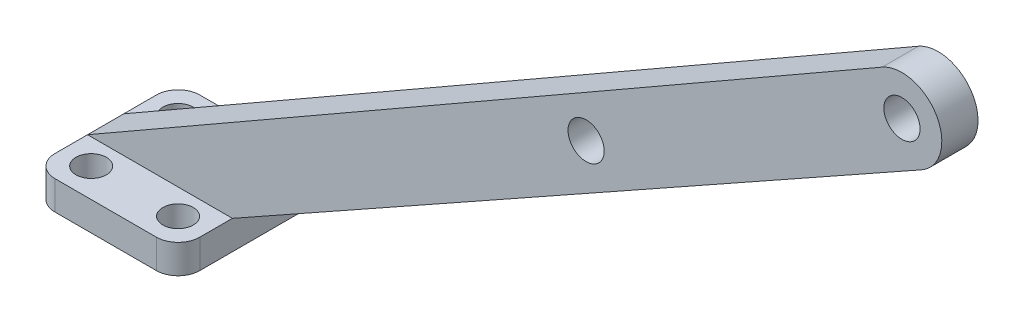
ISO-10303-21;
HEADER;
FILE_DESCRIPTION(('STEP AP214'),'2;1');
FILE_NAME('part.step','',(''),(''),'','','');
FILE_SCHEMA(('AUTOMOTIVE_DESIGN { 1 0 10303 214 1 1 1 1 }'));
ENDSEC;
DATA;
#1=APPLICATION_CONTEXT('core data for automotive mechanical design processes');
#2=APPLICATION_PROTOCOL_DEFINITION('international standard','automotive_design',2000,#1);
#3=PRODUCT_CONTEXT('',#1,'mechanical');
#4=PRODUCT('Part','Part','',(#3));
#5=PRODUCT_RELATED_PRODUCT_CATEGORY('part','',(#4));
#6=PRODUCT_DEFINITION_FORMATION('','',#4);
#7=PRODUCT_DEFINITION_CONTEXT('part definition',#1,'design');
#8=PRODUCT_DEFINITION('design','',#6,#7);
#9=PRODUCT_DEFINITION_SHAPE('','',#8);
#10=(LENGTH_UNIT() NAMED_UNIT(*) SI_UNIT(.MILLI.,.METRE.));
#11=(NAMED_UNIT(*) PLANE_ANGLE_UNIT() SI_UNIT($,.RADIAN.));
#12=(NAMED_UNIT(*) SI_UNIT($,.STERADIAN.) SOLID_ANGLE_UNIT());
#13=UNCERTAINTY_MEASURE_WITH_UNIT(LENGTH_MEASURE(1.E-05),#10,'distance_accuracy_value','');
#14=(GEOMETRIC_REPRESENTATION_CONTEXT(3) GLOBAL_UNCERTAINTY_ASSIGNED_CONTEXT((#13)) GLOBAL_UNIT_ASSIGNED_CONTEXT((#10,
#11,#12)) REPRESENTATION_CONTEXT('',''));
#15=CARTESIAN_POINT('',(0.,0.,0.));
#16=DIRECTION('',(0.,0.,1.));
#17=DIRECTION('',(1.,0.,0.));
#18=AXIS2_PLACEMENT_3D('',#15,#16,#17);
#19=CARTESIAN_POINT('',(102.44,58.16,5.));
#20=DIRECTION('',(0.,0.,1.));
#21=DIRECTION('',(1.,0.,0.));
#22=AXIS2_PLACEMENT_3D('',#19,#20,#21);
#23=PLANE('',#22);
#24=CARTESIAN_POINT('',(58.8322826146433,33.6984590747258,5.));
#25=DIRECTION('',(0.,0.,1.));
#26=DIRECTION('',(1.,0.,0.));
#27=AXIS2_PLACEMENT_3D('',#24,#25,#26);
#28=CIRCLE('',#27,2.5);
#29=CARTESIAN_POINT('',(61.3322826146434,33.6984590747258,5.));
#30=VERTEX_POINT('',#29);
#31=EDGE_CURVE('E283',#30,#30,#28,.T.);
#32=ORIENTED_EDGE('',*,*,#31,.F.);
#33=EDGE_LOOP('',(#32));
#34=FACE_BOUND('',#33,.T.);
#35=DIRECTION('',(-0.867413601573538,-0.497587825218045,0.));
#36=VECTOR('',#35,1.);
#37=CARTESIAN_POINT('',(-10.,0.,5.));
#38=LINE('',#37,#36);
#39=CARTESIAN_POINT('',(99.7032669613008,62.9307748086545,5.));
#40=VERTEX_POINT('',#39);
#41=CARTESIAN_POINT('',(-10.,0.,5.));
#42=VERTEX_POINT('',#41);
#43=EDGE_CURVE('E118',#40,#42,#38,.T.);
#44=ORIENTED_EDGE('',*,*,#43,.T.);
#45=DIRECTION('',(1.,0.,0.));
#46=VECTOR('',#45,1.);
#47=CARTESIAN_POINT('',(10.,0.,5.));
#48=LINE('',#47,#46);
#49=CARTESIAN_POINT('',(10.,0.,5.));
#50=VERTEX_POINT('',#49);
#51=EDGE_CURVE('E107',#42,#50,#48,.T.);
#52=ORIENTED_EDGE('',*,*,#51,.T.);
#53=DIRECTION('',(0.872154347707133,0.489230818505483,0.));
#54=VECTOR('',#53,1.);
#55=CARTESIAN_POINT('',(105.13076950178,53.3631510876108,5.));
#56=LINE('',#55,#54);
#57=CARTESIAN_POINT('',(105.13076950178,53.3631510876108,5.));
#58=VERTEX_POINT('',#57);
#59=EDGE_CURVE('E116',#50,#58,#56,.T.);
#60=ORIENTED_EDGE('',*,*,#59,.T.);
#61=CARTESIAN_POINT('',(102.44,58.16,5.));
#62=DIRECTION('',(0.,0.,1.));
#63=DIRECTION('',(1.,0.,0.));
#64=AXIS2_PLACEMENT_3D('',#61,#62,#63);
#65=CIRCLE('',#64,5.50000000000001);
#66=EDGE_CURVE('E59',#58,#40,#65,.T.);
#67=ORIENTED_EDGE('',*,*,#66,.T.);
#68=EDGE_LOOP('',(#44,#52,#60,#67));
#69=FACE_BOUND('',#68,.T.);
#70=CARTESIAN_POINT('',(102.44,58.16,5.));
#71=DIRECTION('',(0.,0.,1.));
#72=DIRECTION('',(1.,0.,0.));
#73=AXIS2_PLACEMENT_3D('',#70,#71,#72);
#74=CIRCLE('',#73,2.50000000000001);
#75=CARTESIAN_POINT('',(104.94,58.16,5.));
#76=VERTEX_POINT('',#75);
#77=EDGE_CURVE('E134',#76,#76,#74,.T.);
#78=ORIENTED_EDGE('',*,*,#77,.F.);
#79=EDGE_LOOP('',(#78));
#80=FACE_BOUND('',#79,.T.);
#81=ADVANCED_FACE('F40',(#34,#69,#80),#23,.T.);
#82=CARTESIAN_POINT('',(102.44,58.16,0.));
#83=DIRECTION('',(0.,0.,1.));
#84=DIRECTION('',(1.,0.,0.));
#85=AXIS2_PLACEMENT_3D('',#82,#83,#84);
#86=PLANE('',#85);
#87=CARTESIAN_POINT('',(58.8322826146433,33.6984590747258,0.));
#88=DIRECTION('',(0.,0.,1.));
#89=DIRECTION('',(1.,0.,0.));
#90=AXIS2_PLACEMENT_3D('',#87,#88,#89);
#91=CIRCLE('',#90,2.5);
#92=CARTESIAN_POINT('',(61.3322826146434,33.6984590747258,0.));
#93=VERTEX_POINT('',#92);
#94=EDGE_CURVE('E44',#93,#93,#91,.T.);
#95=ORIENTED_EDGE('',*,*,#94,.T.);
#96=EDGE_LOOP('',(#95));
#97=FACE_BOUND('',#96,.T.);
#98=DIRECTION('',(-0.867413601573538,-0.497587825218045,0.));
#99=VECTOR('',#98,1.);
#100=CARTESIAN_POINT('',(-10.,0.,0.));
#101=LINE('',#100,#99);
#102=CARTESIAN_POINT('',(99.7032669613008,62.9307748086545,0.));
#103=VERTEX_POINT('',#102);
#104=CARTESIAN_POINT('',(-10.,0.,0.));
#105=VERTEX_POINT('',#104);
#106=EDGE_CURVE('E130',#103,#105,#101,.T.);
#107=ORIENTED_EDGE('',*,*,#106,.F.);
#108=CARTESIAN_POINT('',(102.44,58.16,0.));
#109=DIRECTION('',(0.,0.,1.));
#110=DIRECTION('',(1.,0.,0.));
#111=AXIS2_PLACEMENT_3D('',#108,#109,#110);
#112=CIRCLE('',#111,5.50000000000001);
#113=CARTESIAN_POINT('',(105.13076950178,53.3631510876108,0.));
#114=VERTEX_POINT('',#113);
#115=EDGE_CURVE('E139',#114,#103,#112,.T.);
#116=ORIENTED_EDGE('',*,*,#115,.F.);
#117=DIRECTION('',(0.872154347707133,0.489230818505483,0.));
#118=VECTOR('',#117,1.);
#119=CARTESIAN_POINT('',(105.13076950178,53.3631510876108,0.));
#120=LINE('',#119,#118);
#121=CARTESIAN_POINT('',(10.,0.,0.));
#122=VERTEX_POINT('',#121);
#123=EDGE_CURVE('E71',#122,#114,#120,.T.);
#124=ORIENTED_EDGE('',*,*,#123,.F.);
#125=DIRECTION('',(1.,0.,0.));
#126=VECTOR('',#125,1.);
#127=CARTESIAN_POINT('',(10.,0.,0.));
#128=LINE('',#127,#126);
#129=EDGE_CURVE('E81',#105,#122,#128,.T.);
#130=ORIENTED_EDGE('',*,*,#129,.F.);
#131=EDGE_LOOP('',(#107,#116,#124,#130));
#132=FACE_BOUND('',#131,.T.);
#133=CARTESIAN_POINT('',(102.44,58.16,0.));
#134=DIRECTION('',(0.,0.,1.));
#135=DIRECTION('',(1.,0.,0.));
#136=AXIS2_PLACEMENT_3D('',#133,#134,#135);
#137=CIRCLE('',#136,2.50000000000001);
#138=CARTESIAN_POINT('',(104.94,58.16,0.));
#139=VERTEX_POINT('',#138);
#140=EDGE_CURVE('E156',#139,#139,#137,.T.);
#141=ORIENTED_EDGE('',*,*,#140,.T.);
#142=EDGE_LOOP('',(#141));
#143=FACE_BOUND('',#142,.T.);
#144=ADVANCED_FACE('F151',(#97,#132,#143),#86,.F.);
#145=CARTESIAN_POINT('',(-10.,0.,5.));
#146=DIRECTION('',(0.497587825218045,-0.867413601573538,0.));
#147=DIRECTION('',(0.867413601573538,0.497587825218045,0.));
#148=AXIS2_PLACEMENT_3D('',#145,#146,#147);
#149=PLANE('',#148);
#150=ORIENTED_EDGE('',*,*,#106,.T.);
#151=DIRECTION('',(0.,0.,-1.));
#152=VECTOR('',#151,1.);
#153=CARTESIAN_POINT('',(-10.,0.,5.));
#154=LINE('',#153,#152);
#155=EDGE_CURVE('E11',#42,#105,#154,.T.);
#156=ORIENTED_EDGE('',*,*,#155,.F.);
#157=ORIENTED_EDGE('',*,*,#43,.F.);
#158=DIRECTION('',(0.,0.,-1.));
#159=VECTOR('',#158,1.);
#160=CARTESIAN_POINT('',(99.7032669613008,62.9307748086545,5.));
#161=LINE('',#160,#159);
#162=EDGE_CURVE('E126',#40,#103,#161,.T.);
#163=ORIENTED_EDGE('',*,*,#162,.T.);
#164=EDGE_LOOP('',(#150,#156,#157,#163));
#165=FACE_BOUND('',#164,.T.);
#166=ADVANCED_FACE('F42',(#165),#149,.F.);
#167=CARTESIAN_POINT('',(105.13076950178,53.3631510876108,5.));
#168=DIRECTION('',(-0.489230818505483,0.872154347707133,0.));
#169=DIRECTION('',(-0.872154347707133,-0.489230818505483,0.));
#170=AXIS2_PLACEMENT_3D('',#167,#168,#169);
#171=PLANE('',#170);
#172=ORIENTED_EDGE('',*,*,#123,.T.);
#173=DIRECTION('',(0.,0.,-1.));
#174=VECTOR('',#173,1.);
#175=CARTESIAN_POINT('',(105.13076950178,53.3631510876108,5.));
#176=LINE('',#175,#174);
#177=EDGE_CURVE('E99',#58,#114,#176,.T.);
#178=ORIENTED_EDGE('',*,*,#177,.F.);
#179=ORIENTED_EDGE('',*,*,#59,.F.);
#180=DIRECTION('',(0.,0.,-1.));
#181=VECTOR('',#180,1.);
#182=CARTESIAN_POINT('',(10.,0.,5.));
#183=LINE('',#182,#181);
#184=EDGE_CURVE('E51',#50,#122,#183,.T.);
#185=ORIENTED_EDGE('',*,*,#184,.T.);
#186=EDGE_LOOP('',(#172,#178,#179,#185));
#187=FACE_BOUND('',#186,.T.);
#188=ADVANCED_FACE('F122',(#187),#171,.F.);
#189=CARTESIAN_POINT('',(102.44,58.16,5.));
#190=DIRECTION('',(0.,0.,-1.));
#191=DIRECTION('',(-1.,0.,0.));
#192=AXIS2_PLACEMENT_3D('',#189,#190,#191);
#193=CYLINDRICAL_SURFACE('',#192,5.50000000000001);
#194=ORIENTED_EDGE('',*,*,#115,.T.);
#195=ORIENTED_EDGE('',*,*,#162,.F.);
#196=ORIENTED_EDGE('',*,*,#66,.F.);
#197=ORIENTED_EDGE('',*,*,#177,.T.);
#198=EDGE_LOOP('',(#194,#195,#196,#197));
#199=FACE_BOUND('',#198,.T.);
#200=ADVANCED_FACE('F148',(#199),#193,.T.);
#201=CARTESIAN_POINT('',(102.44,58.16,5.));
#202=DIRECTION('',(0.,0.,-1.));
#203=DIRECTION('',(-1.,0.,0.));
#204=AXIS2_PLACEMENT_3D('',#201,#202,#203);
#205=CYLINDRICAL_SURFACE('',#204,2.50000000000001);
#206=ORIENTED_EDGE('',*,*,#77,.T.);
#207=EDGE_LOOP('',(#206));
#208=FACE_BOUND('',#207,.T.);
#209=ORIENTED_EDGE('',*,*,#140,.F.);
#210=EDGE_LOOP('',(#209));
#211=FACE_BOUND('',#210,.T.);
#212=ADVANCED_FACE('F312',(#208,#211),#205,.F.);
#213=CARTESIAN_POINT('',(-7.,0.,-4.5));
#214=DIRECTION('',(0.,1.,0.));
#215=DIRECTION('',(-1.,0.,0.));
#216=AXIS2_PLACEMENT_3D('',#213,#214,#215);
#217=PLANE('',#216);
#218=CARTESIAN_POINT('',(5.99988022006812,0.,8.5));
#219=DIRECTION('',(0.,-1.,0.));
#220=DIRECTION('',(1.,0.,0.));
#221=AXIS2_PLACEMENT_3D('',#218,#219,#220);
#222=CIRCLE('',#221,2.1);
#223=CARTESIAN_POINT('',(8.09988022006812,0.,8.5));
#224=VERTEX_POINT('',#223);
#225=EDGE_CURVE('E260',#224,#224,#222,.T.);
#226=ORIENTED_EDGE('',*,*,#225,.T.);
#227=EDGE_LOOP('',(#226));
#228=FACE_BOUND('',#227,.T.);
#229=CARTESIAN_POINT('',(-6.,0.,8.5));
#230=DIRECTION('',(0.,-1.,0.));
#231=DIRECTION('',(1.,0.,0.));
#232=AXIS2_PLACEMENT_3D('',#229,#230,#231);
#233=CIRCLE('',#232,2.1);
#234=CARTESIAN_POINT('',(-3.9,0.,8.5));
#235=VERTEX_POINT('',#234);
#236=EDGE_CURVE('E252',#235,#235,#233,.T.);
#237=ORIENTED_EDGE('',*,*,#236,.T.);
#238=EDGE_LOOP('',(#237));
#239=FACE_BOUND('',#238,.T.);
#240=ORIENTED_EDGE('',*,*,#51,.F.);
#241=DIRECTION('',(0.,0.,-1.));
#242=VECTOR('',#241,1.);
#243=CARTESIAN_POINT('',(-10.,0.,-4.49999999999998));
#244=LINE('',#243,#242);
#245=CARTESIAN_POINT('',(-10.,0.,9.49999999999998));
#246=VERTEX_POINT('',#245);
#247=EDGE_CURVE('E194',#246,#42,#244,.T.);
#248=ORIENTED_EDGE('',*,*,#247,.F.);
#249=CARTESIAN_POINT('',(-7.,0.,9.5));
#250=DIRECTION('',(0.,-1.,0.));
#251=DIRECTION('',(-1.,0.,0.));
#252=AXIS2_PLACEMENT_3D('',#249,#250,#251);
#253=CIRCLE('',#252,3.);
#254=CARTESIAN_POINT('',(-6.99999999999998,0.,12.5));
#255=VERTEX_POINT('',#254);
#256=EDGE_CURVE('E199',#255,#246,#253,.T.);
#257=ORIENTED_EDGE('',*,*,#256,.F.);
#258=DIRECTION('',(-1.,0.,0.));
#259=VECTOR('',#258,1.);
#260=CARTESIAN_POINT('',(6.99999999999998,0.,12.5));
#261=LINE('',#260,#259);
#262=CARTESIAN_POINT('',(6.99999999999998,0.,12.5));
#263=VERTEX_POINT('',#262);
#264=EDGE_CURVE('E203',#263,#255,#261,.T.);
#265=ORIENTED_EDGE('',*,*,#264,.F.);
#266=CARTESIAN_POINT('',(7.,0.,9.50000000000001));
#267=DIRECTION('',(0.,-1.,0.));
#268=DIRECTION('',(1.,0.,0.));
#269=AXIS2_PLACEMENT_3D('',#266,#267,#268);
#270=CIRCLE('',#269,3.);
#271=CARTESIAN_POINT('',(10.,0.,9.49999999999998));
#272=VERTEX_POINT('',#271);
#273=EDGE_CURVE('E111',#272,#263,#270,.T.);
#274=ORIENTED_EDGE('',*,*,#273,.F.);
#275=DIRECTION('',(0.,0.,1.));
#276=VECTOR('',#275,1.);
#277=CARTESIAN_POINT('',(10.,0.,-4.49999999999998));
#278=LINE('',#277,#276);
#279=EDGE_CURVE('E93',#50,#272,#278,.T.);
#280=ORIENTED_EDGE('',*,*,#279,.F.);
#281=EDGE_LOOP('',(#240,#248,#257,#265,#274,#280));
#282=FACE_BOUND('',#281,.T.);
#283=ADVANCED_FACE('F105',(#228,#239,#282),#217,.T.);
#284=CARTESIAN_POINT('',(-7.,-4.,-4.5));
#285=DIRECTION('',(0.,1.,0.));
#286=DIRECTION('',(-1.,0.,0.));
#287=AXIS2_PLACEMENT_3D('',#284,#285,#286);
#288=PLANE('',#287);
#289=CARTESIAN_POINT('',(-7.,-4.,-4.5));
#290=DIRECTION('',(0.,-1.,0.));
#291=DIRECTION('',(-1.,0.,0.));
#292=AXIS2_PLACEMENT_3D('',#289,#290,#291);
#293=CIRCLE('',#292,3.);
#294=CARTESIAN_POINT('',(-10.,-4.,-4.49999999999998));
#295=VERTEX_POINT('',#294);
#296=CARTESIAN_POINT('',(-6.99999999999998,-4.,-7.5));
#297=VERTEX_POINT('',#296);
#298=EDGE_CURVE('E197',#295,#297,#293,.T.);
#299=ORIENTED_EDGE('',*,*,#298,.T.);
#300=DIRECTION('',(1.,0.,0.));
#301=VECTOR('',#300,1.);
#302=CARTESIAN_POINT('',(6.99999999999998,-4.,-7.5));
#303=LINE('',#302,#301);
#304=CARTESIAN_POINT('',(6.99999999999998,-4.,-7.5));
#305=VERTEX_POINT('',#304);
#306=EDGE_CURVE('E245',#297,#305,#303,.T.);
#307=ORIENTED_EDGE('',*,*,#306,.T.);
#308=CARTESIAN_POINT('',(7.,-4.,-4.5));
#309=DIRECTION('',(0.,-1.,0.));
#310=DIRECTION('',(1.,0.,0.));
#311=AXIS2_PLACEMENT_3D('',#308,#309,#310);
#312=CIRCLE('',#311,3.);
#313=CARTESIAN_POINT('',(10.,-4.,-4.5));
#314=VERTEX_POINT('',#313);
#315=EDGE_CURVE('E241',#305,#314,#312,.T.);
#316=ORIENTED_EDGE('',*,*,#315,.T.);
#317=DIRECTION('',(0.,0.,1.));
#318=VECTOR('',#317,1.);
#319=CARTESIAN_POINT('',(10.,-4.,-4.49999999999998));
#320=LINE('',#319,#318);
#321=CARTESIAN_POINT('',(10.,-4.,9.49999999999998));
#322=VERTEX_POINT('',#321);
#323=EDGE_CURVE('E237',#314,#322,#320,.T.);
#324=ORIENTED_EDGE('',*,*,#323,.T.);
#325=CARTESIAN_POINT('',(7.,-4.,9.50000000000001));
#326=DIRECTION('',(0.,-1.,0.));
#327=DIRECTION('',(1.,0.,0.));
#328=AXIS2_PLACEMENT_3D('',#325,#326,#327);
#329=CIRCLE('',#328,3.);
#330=CARTESIAN_POINT('',(6.99999999999998,-4.,12.5));
#331=VERTEX_POINT('',#330);
#332=EDGE_CURVE('E233',#322,#331,#329,.T.);
#333=ORIENTED_EDGE('',*,*,#332,.T.);
#334=DIRECTION('',(-1.,0.,0.));
#335=VECTOR('',#334,1.);
#336=CARTESIAN_POINT('',(6.99999999999998,-4.,12.5));
#337=LINE('',#336,#335);
#338=CARTESIAN_POINT('',(-6.99999999999998,-4.,12.5));
#339=VERTEX_POINT('',#338);
#340=EDGE_CURVE('E229',#331,#339,#337,.T.);
#341=ORIENTED_EDGE('',*,*,#340,.T.);
#342=CARTESIAN_POINT('',(-7.,-4.,9.5));
#343=DIRECTION('',(0.,-1.,0.));
#344=DIRECTION('',(-1.,0.,0.));
#345=AXIS2_PLACEMENT_3D('',#342,#343,#344);
#346=CIRCLE('',#345,3.);
#347=CARTESIAN_POINT('',(-10.,-4.,9.49999999999998));
#348=VERTEX_POINT('',#347);
#349=EDGE_CURVE('E225',#339,#348,#346,.T.);
#350=ORIENTED_EDGE('',*,*,#349,.T.);
#351=DIRECTION('',(0.,0.,-1.));
#352=VECTOR('',#351,1.);
#353=CARTESIAN_POINT('',(-10.,-4.,-4.49999999999998));
#354=LINE('',#353,#352);
#355=EDGE_CURVE('E193',#348,#295,#354,.T.);
#356=ORIENTED_EDGE('',*,*,#355,.T.);
#357=EDGE_LOOP('',(#299,#307,#316,#324,#333,#341,#350,#356));
#358=FACE_BOUND('',#357,.T.);
#359=CARTESIAN_POINT('',(-6.,-4.,8.5));
#360=DIRECTION('',(0.,-1.,0.));
#361=DIRECTION('',(1.,0.,0.));
#362=AXIS2_PLACEMENT_3D('',#359,#360,#361);
#363=CIRCLE('',#362,2.1);
#364=CARTESIAN_POINT('',(-3.9,-4.,8.5));
#365=VERTEX_POINT('',#364);
#366=EDGE_CURVE('E221',#365,#365,#363,.T.);
#367=ORIENTED_EDGE('',*,*,#366,.F.);
#368=EDGE_LOOP('',(#367));
#369=FACE_BOUND('',#368,.T.);
#370=CARTESIAN_POINT('',(5.99988022006812,-4.,8.5));
#371=DIRECTION('',(0.,-1.,0.));
#372=DIRECTION('',(1.,0.,0.));
#373=AXIS2_PLACEMENT_3D('',#370,#371,#372);
#374=CIRCLE('',#373,2.1);
#375=CARTESIAN_POINT('',(8.09988022006812,-4.,8.5));
#376=VERTEX_POINT('',#375);
#377=EDGE_CURVE('E256',#376,#376,#374,.T.);
#378=ORIENTED_EDGE('',*,*,#377,.F.);
#379=EDGE_LOOP('',(#378));
#380=FACE_BOUND('',#379,.T.);
#381=CARTESIAN_POINT('',(5.99988022006812,-4.,-3.49999999999999));
#382=DIRECTION('',(0.,-1.,0.));
#383=DIRECTION('',(-1.,0.,0.));
#384=AXIS2_PLACEMENT_3D('',#381,#382,#383);
#385=CIRCLE('',#384,2.1);
#386=CARTESIAN_POINT('',(3.89988022006812,-4.,-3.49999999999999));
#387=VERTEX_POINT('',#386);
#388=EDGE_CURVE('E264',#387,#387,#385,.T.);
#389=ORIENTED_EDGE('',*,*,#388,.F.);
#390=EDGE_LOOP('',(#389));
#391=FACE_BOUND('',#390,.T.);
#392=CARTESIAN_POINT('',(-6.,-4.,-3.5));
#393=DIRECTION('',(0.,-1.,0.));
#394=DIRECTION('',(-1.,0.,0.));
#395=AXIS2_PLACEMENT_3D('',#392,#393,#394);
#396=CIRCLE('',#395,2.1);
#397=CARTESIAN_POINT('',(-8.09999999999999,-4.,-3.5));
#398=VERTEX_POINT('',#397);
#399=EDGE_CURVE('E272',#398,#398,#396,.T.);
#400=ORIENTED_EDGE('',*,*,#399,.F.);
#401=EDGE_LOOP('',(#400));
#402=FACE_BOUND('',#401,.T.);
#403=ADVANCED_FACE('F445',(#358,#369,#380,#391,#402),#288,.F.);
#404=CARTESIAN_POINT('',(5.99988022006812,0.,-3.49999999999999));
#405=DIRECTION('',(0.,-1.,0.));
#406=DIRECTION('',(-1.,0.,0.));
#407=AXIS2_PLACEMENT_3D('',#404,#405,#406);
#408=CIRCLE('',#407,2.1);
#409=CARTESIAN_POINT('',(3.89988022006812,0.,-3.49999999999999));
#410=VERTEX_POINT('',#409);
#411=EDGE_CURVE('E268',#410,#410,#408,.T.);
#412=ORIENTED_EDGE('',*,*,#411,.T.);
#413=EDGE_LOOP('',(#412));
#414=FACE_BOUND('',#413,.T.);
#415=CARTESIAN_POINT('',(-10.,0.,-4.49999999999998));
#416=VERTEX_POINT('',#415);
#417=EDGE_CURVE('E198',#105,#416,#244,.T.);
#418=ORIENTED_EDGE('',*,*,#417,.F.);
#419=ORIENTED_EDGE('',*,*,#129,.T.);
#420=CARTESIAN_POINT('',(10.,0.,-4.5));
#421=VERTEX_POINT('',#420);
#422=EDGE_CURVE('E96',#421,#122,#278,.T.);
#423=ORIENTED_EDGE('',*,*,#422,.F.);
#424=CARTESIAN_POINT('',(7.,0.,-4.5));
#425=DIRECTION('',(0.,-1.,0.));
#426=DIRECTION('',(1.,0.,0.));
#427=AXIS2_PLACEMENT_3D('',#424,#425,#426);
#428=CIRCLE('',#427,3.);
#429=CARTESIAN_POINT('',(6.99999999999998,0.,-7.5));
#430=VERTEX_POINT('',#429);
#431=EDGE_CURVE('E113',#430,#421,#428,.T.);
#432=ORIENTED_EDGE('',*,*,#431,.F.);
#433=DIRECTION('',(1.,0.,0.));
#434=VECTOR('',#433,1.);
#435=CARTESIAN_POINT('',(6.99999999999998,0.,-7.5));
#436=LINE('',#435,#434);
#437=CARTESIAN_POINT('',(-6.99999999999998,0.,-7.5));
#438=VERTEX_POINT('',#437);
#439=EDGE_CURVE('E213',#438,#430,#436,.T.);
#440=ORIENTED_EDGE('',*,*,#439,.F.);
#441=CARTESIAN_POINT('',(-7.,0.,-4.5));
#442=DIRECTION('',(0.,-1.,0.));
#443=DIRECTION('',(-1.,0.,0.));
#444=AXIS2_PLACEMENT_3D('',#441,#442,#443);
#445=CIRCLE('',#444,3.);
#446=EDGE_CURVE('E217',#416,#438,#445,.T.);
#447=ORIENTED_EDGE('',*,*,#446,.F.);
#448=EDGE_LOOP('',(#418,#419,#423,#432,#440,#447));
#449=FACE_BOUND('',#448,.T.);
#450=CARTESIAN_POINT('',(-6.,0.,-3.5));
#451=DIRECTION('',(0.,-1.,0.));
#452=DIRECTION('',(-1.,0.,0.));
#453=AXIS2_PLACEMENT_3D('',#450,#451,#452);
#454=CIRCLE('',#453,2.1);
#455=CARTESIAN_POINT('',(-8.1,0.,-3.5));
#456=VERTEX_POINT('',#455);
#457=EDGE_CURVE('E276',#456,#456,#454,.T.);
#458=ORIENTED_EDGE('',*,*,#457,.T.);
#459=EDGE_LOOP('',(#458));
#460=FACE_BOUND('',#459,.T.);
#461=ADVANCED_FACE('F437',(#414,#449,#460),#217,.T.);
#462=CARTESIAN_POINT('',(-7.,-4.,-4.5));
#463=DIRECTION('',(0.,1.,0.));
#464=DIRECTION('',(-1.,0.,0.));
#465=AXIS2_PLACEMENT_3D('',#462,#463,#464);
#466=CYLINDRICAL_SURFACE('',#465,3.);
#467=ORIENTED_EDGE('',*,*,#446,.T.);
#468=DIRECTION('',(0.,1.,0.));
#469=VECTOR('',#468,1.);
#470=CARTESIAN_POINT('',(-6.99999999999998,-4.,-7.5));
#471=LINE('',#470,#469);
#472=EDGE_CURVE('E160',#297,#438,#471,.T.);
#473=ORIENTED_EDGE('',*,*,#472,.F.);
#474=ORIENTED_EDGE('',*,*,#298,.F.);
#475=DIRECTION('',(0.,1.,0.));
#476=VECTOR('',#475,1.);
#477=CARTESIAN_POINT('',(-10.,-4.,-4.49999999999998));
#478=LINE('',#477,#476);
#479=EDGE_CURVE('E189',#295,#416,#478,.T.);
#480=ORIENTED_EDGE('',*,*,#479,.T.);
#481=EDGE_LOOP('',(#467,#473,#474,#480));
#482=FACE_BOUND('',#481,.T.);
#483=ADVANCED_FACE('F428',(#482),#466,.T.);
#484=CARTESIAN_POINT('',(6.99999999999998,-4.,-7.5));
#485=DIRECTION('',(0.,0.,1.));
#486=DIRECTION('',(1.,0.,0.));
#487=AXIS2_PLACEMENT_3D('',#484,#485,#486);
#488=PLANE('',#487);
#489=ORIENTED_EDGE('',*,*,#439,.T.);
#490=DIRECTION('',(0.,1.,0.));
#491=VECTOR('',#490,1.);
#492=CARTESIAN_POINT('',(6.99999999999998,-4.,-7.5));
#493=LINE('',#492,#491);
#494=EDGE_CURVE('E167',#305,#430,#493,.T.);
#495=ORIENTED_EDGE('',*,*,#494,.F.);
#496=ORIENTED_EDGE('',*,*,#306,.F.);
#497=ORIENTED_EDGE('',*,*,#472,.T.);
#498=EDGE_LOOP('',(#489,#495,#496,#497));
#499=FACE_BOUND('',#498,.T.);
#500=ADVANCED_FACE('F419',(#499),#488,.F.);
#501=CARTESIAN_POINT('',(7.,-4.,-4.5));
#502=DIRECTION('',(0.,1.,0.));
#503=DIRECTION('',(-1.,0.,0.));
#504=AXIS2_PLACEMENT_3D('',#501,#502,#503);
#505=CYLINDRICAL_SURFACE('',#504,3.);
#506=ORIENTED_EDGE('',*,*,#431,.T.);
#507=DIRECTION('',(0.,1.,0.));
#508=VECTOR('',#507,1.);
#509=CARTESIAN_POINT('',(10.,-4.,-4.5));
#510=LINE('',#509,#508);
#511=EDGE_CURVE('E171',#314,#421,#510,.T.);
#512=ORIENTED_EDGE('',*,*,#511,.F.);
#513=ORIENTED_EDGE('',*,*,#315,.F.);
#514=ORIENTED_EDGE('',*,*,#494,.T.);
#515=EDGE_LOOP('',(#506,#512,#513,#514));
#516=FACE_BOUND('',#515,.T.);
#517=ADVANCED_FACE('F411',(#516),#505,.T.);
#518=CARTESIAN_POINT('',(10.,-4.,-4.49999999999998));
#519=DIRECTION('',(-1.,0.,0.));
#520=DIRECTION('',(0.,-1.,0.));
#521=AXIS2_PLACEMENT_3D('',#518,#519,#520);
#522=PLANE('',#521);
#523=ORIENTED_EDGE('',*,*,#422,.T.);
#524=ORIENTED_EDGE('',*,*,#184,.F.);
#525=ORIENTED_EDGE('',*,*,#279,.T.);
#526=DIRECTION('',(0.,1.,0.));
#527=VECTOR('',#526,1.);
#528=CARTESIAN_POINT('',(10.,-4.,9.49999999999998));
#529=LINE('',#528,#527);
#530=EDGE_CURVE('E174',#322,#272,#529,.T.);
#531=ORIENTED_EDGE('',*,*,#530,.F.);
#532=ORIENTED_EDGE('',*,*,#323,.F.);
#533=ORIENTED_EDGE('',*,*,#511,.T.);
#534=EDGE_LOOP('',(#523,#524,#525,#531,#532,#533));
#535=FACE_BOUND('',#534,.T.);
#536=ADVANCED_FACE('F90',(#535),#522,.F.);
#537=CARTESIAN_POINT('',(7.,-4.,9.50000000000001));
#538=DIRECTION('',(0.,1.,0.));
#539=DIRECTION('',(-1.,0.,0.));
#540=AXIS2_PLACEMENT_3D('',#537,#538,#539);
#541=CYLINDRICAL_SURFACE('',#540,3.);
#542=ORIENTED_EDGE('',*,*,#273,.T.);
#543=DIRECTION('',(0.,1.,0.));
#544=VECTOR('',#543,1.);
#545=CARTESIAN_POINT('',(6.99999999999998,-4.,12.5));
#546=LINE('',#545,#544);
#547=EDGE_CURVE('E177',#331,#263,#546,.T.);
#548=ORIENTED_EDGE('',*,*,#547,.F.);
#549=ORIENTED_EDGE('',*,*,#332,.F.);
#550=ORIENTED_EDGE('',*,*,#530,.T.);
#551=EDGE_LOOP('',(#542,#548,#549,#550));
#552=FACE_BOUND('',#551,.T.);
#553=ADVANCED_FACE('F394',(#552),#541,.T.);
#554=CARTESIAN_POINT('',(6.99999999999998,-4.,12.5));
#555=DIRECTION('',(0.,0.,-1.));
#556=DIRECTION('',(-1.,0.,0.));
#557=AXIS2_PLACEMENT_3D('',#554,#555,#556);
#558=PLANE('',#557);
#559=ORIENTED_EDGE('',*,*,#264,.T.);
#560=DIRECTION('',(0.,1.,0.));
#561=VECTOR('',#560,1.);
#562=CARTESIAN_POINT('',(-6.99999999999998,-4.,12.5));
#563=LINE('',#562,#561);
#564=EDGE_CURVE('E181',#339,#255,#563,.T.);
#565=ORIENTED_EDGE('',*,*,#564,.F.);
#566=ORIENTED_EDGE('',*,*,#340,.F.);
#567=ORIENTED_EDGE('',*,*,#547,.T.);
#568=EDGE_LOOP('',(#559,#565,#566,#567));
#569=FACE_BOUND('',#568,.T.);
#570=ADVANCED_FACE('F385',(#569),#558,.F.);
#571=CARTESIAN_POINT('',(-7.,-4.,9.5));
#572=DIRECTION('',(0.,1.,0.));
#573=DIRECTION('',(-1.,0.,0.));
#574=AXIS2_PLACEMENT_3D('',#571,#572,#573);
#575=CYLINDRICAL_SURFACE('',#574,3.);
#576=ORIENTED_EDGE('',*,*,#256,.T.);
#577=DIRECTION('',(0.,1.,0.));
#578=VECTOR('',#577,1.);
#579=CARTESIAN_POINT('',(-10.,-4.,9.49999999999998));
#580=LINE('',#579,#578);
#581=EDGE_CURVE('E185',#348,#246,#580,.T.);
#582=ORIENTED_EDGE('',*,*,#581,.F.);
#583=ORIENTED_EDGE('',*,*,#349,.F.);
#584=ORIENTED_EDGE('',*,*,#564,.T.);
#585=EDGE_LOOP('',(#576,#582,#583,#584));
#586=FACE_BOUND('',#585,.T.);
#587=ADVANCED_FACE('F376',(#586),#575,.T.);
#588=CARTESIAN_POINT('',(-10.,-4.,-4.49999999999998));
#589=DIRECTION('',(1.,0.,0.));
#590=DIRECTION('',(0.,1.,0.));
#591=AXIS2_PLACEMENT_3D('',#588,#589,#590);
#592=PLANE('',#591);
#593=ORIENTED_EDGE('',*,*,#247,.T.);
#594=ORIENTED_EDGE('',*,*,#155,.T.);
#595=ORIENTED_EDGE('',*,*,#417,.T.);
#596=ORIENTED_EDGE('',*,*,#479,.F.);
#597=ORIENTED_EDGE('',*,*,#355,.F.);
#598=ORIENTED_EDGE('',*,*,#581,.T.);
#599=EDGE_LOOP('',(#593,#594,#595,#596,#597,#598));
#600=FACE_BOUND('',#599,.T.);
#601=ADVANCED_FACE('F367',(#600),#592,.F.);
#602=CARTESIAN_POINT('',(-6.,-4.,8.5));
#603=DIRECTION('',(0.,1.,0.));
#604=DIRECTION('',(-1.,0.,0.));
#605=AXIS2_PLACEMENT_3D('',#602,#603,#604);
#606=CYLINDRICAL_SURFACE('',#605,2.1);
#607=ORIENTED_EDGE('',*,*,#366,.T.);
#608=EDGE_LOOP('',(#607));
#609=FACE_BOUND('',#608,.T.);
#610=ORIENTED_EDGE('',*,*,#236,.F.);
#611=EDGE_LOOP('',(#610));
#612=FACE_BOUND('',#611,.T.);
#613=ADVANCED_FACE('F358',(#609,#612),#606,.F.);
#614=CARTESIAN_POINT('',(5.99988022006812,-4.,8.5));
#615=DIRECTION('',(0.,1.,0.));
#616=DIRECTION('',(-1.,0.,0.));
#617=AXIS2_PLACEMENT_3D('',#614,#615,#616);
#618=CYLINDRICAL_SURFACE('',#617,2.1);
#619=ORIENTED_EDGE('',*,*,#377,.T.);
#620=EDGE_LOOP('',(#619));
#621=FACE_BOUND('',#620,.T.);
#622=ORIENTED_EDGE('',*,*,#225,.F.);
#623=EDGE_LOOP('',(#622));
#624=FACE_BOUND('',#623,.T.);
#625=ADVANCED_FACE('F349',(#621,#624),#618,.F.);
#626=CARTESIAN_POINT('',(5.99988022006812,-4.,-3.49999999999999));
#627=DIRECTION('',(0.,1.,0.));
#628=DIRECTION('',(-1.,0.,0.));
#629=AXIS2_PLACEMENT_3D('',#626,#627,#628);
#630=CYLINDRICAL_SURFACE('',#629,2.1);
#631=ORIENTED_EDGE('',*,*,#388,.T.);
#632=EDGE_LOOP('',(#631));
#633=FACE_BOUND('',#632,.T.);
#634=ORIENTED_EDGE('',*,*,#411,.F.);
#635=EDGE_LOOP('',(#634));
#636=FACE_BOUND('',#635,.T.);
#637=ADVANCED_FACE('F300',(#633,#636),#630,.F.);
#638=CARTESIAN_POINT('',(-6.,-4.,-3.5));
#639=DIRECTION('',(0.,1.,0.));
#640=DIRECTION('',(-1.,0.,0.));
#641=AXIS2_PLACEMENT_3D('',#638,#639,#640);
#642=CYLINDRICAL_SURFACE('',#641,2.1);
#643=ORIENTED_EDGE('',*,*,#399,.T.);
#644=EDGE_LOOP('',(#643));
#645=FACE_BOUND('',#644,.T.);
#646=ORIENTED_EDGE('',*,*,#457,.F.);
#647=EDGE_LOOP('',(#646));
#648=FACE_BOUND('',#647,.T.);
#649=ADVANCED_FACE('F295',(#645,#648),#642,.F.);
#650=CARTESIAN_POINT('',(58.8322826146433,33.6984590747258,-5.));
#651=DIRECTION('',(0.,0.,1.));
#652=DIRECTION('',(1.,0.,0.));
#653=AXIS2_PLACEMENT_3D('',#650,#651,#652);
#654=CYLINDRICAL_SURFACE('',#653,2.5);
#655=ORIENTED_EDGE('',*,*,#31,.T.);
#656=EDGE_LOOP('',(#655));
#657=FACE_BOUND('',#656,.T.);
#658=ORIENTED_EDGE('',*,*,#94,.F.);
#659=EDGE_LOOP('',(#658));
#660=FACE_BOUND('',#659,.T.);
#661=ADVANCED_FACE('F293',(#657,#660),#654,.F.);
#662=CLOSED_SHELL('',(#81,#144,#166,#188,#200,#212,#283,#403,#461,#483,#500,#517,#536,#553,#570,
#587,#601,#613,#625,#637,#649,#661));
#663=MANIFOLD_SOLID_BREP('B2',#662);
#664=ADVANCED_BREP_SHAPE_REPRESENTATION('',(#18,#663),#14);
#665=SHAPE_DEFINITION_REPRESENTATION(#9,#664);
ENDSEC;
END-ISO-10303-21;
